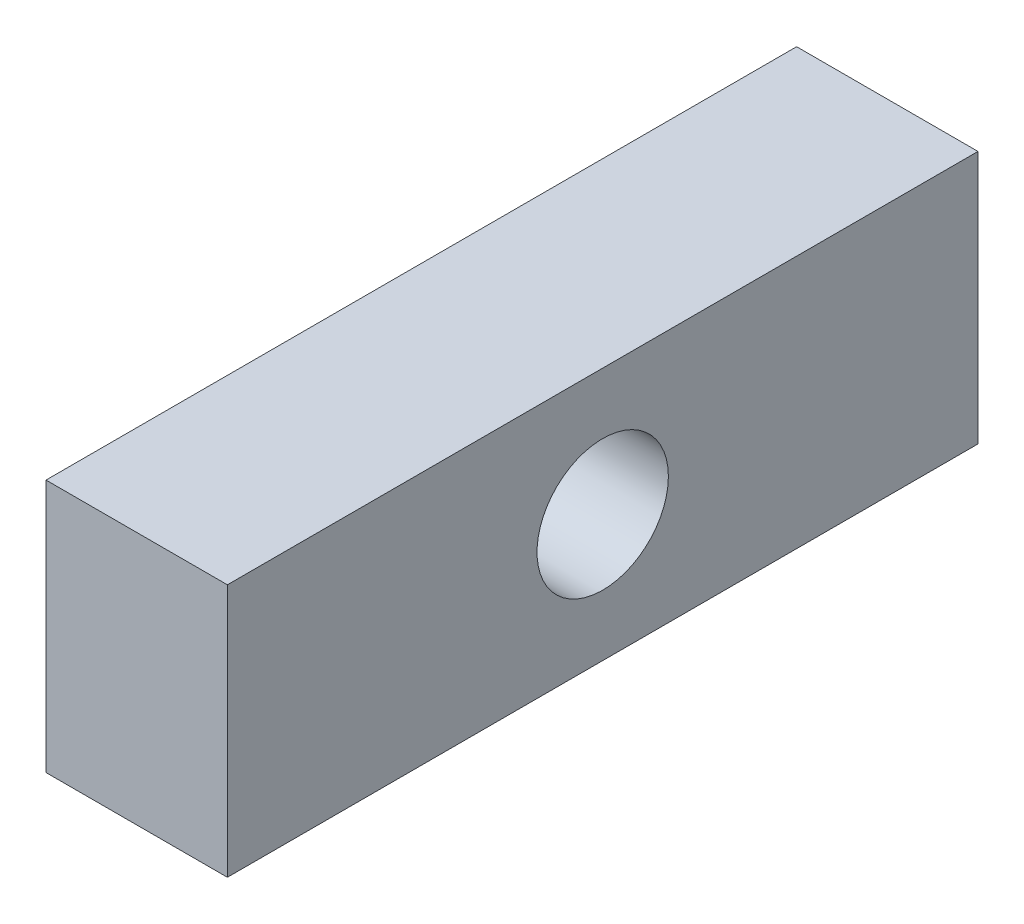
ISO-10303-21;
HEADER;
FILE_DESCRIPTION(('STEP AP214'),'2;1');
FILE_NAME('part.step','',(''),(''),'','','');
FILE_SCHEMA(('AUTOMOTIVE_DESIGN { 1 0 10303 214 1 1 1 1 }'));
ENDSEC;
DATA;
#1=APPLICATION_CONTEXT('core data for automotive mechanical design processes');
#2=APPLICATION_PROTOCOL_DEFINITION('international standard','automotive_design',2000,#1);
#3=PRODUCT_CONTEXT('',#1,'mechanical');
#4=PRODUCT('Part','Part','',(#3));
#5=PRODUCT_RELATED_PRODUCT_CATEGORY('part','',(#4));
#6=PRODUCT_DEFINITION_FORMATION('','',#4);
#7=PRODUCT_DEFINITION_CONTEXT('part definition',#1,'design');
#8=PRODUCT_DEFINITION('design','',#6,#7);
#9=PRODUCT_DEFINITION_SHAPE('','',#8);
#10=(LENGTH_UNIT() NAMED_UNIT(*) SI_UNIT(.MILLI.,.METRE.));
#11=(NAMED_UNIT(*) PLANE_ANGLE_UNIT() SI_UNIT($,.RADIAN.));
#12=(NAMED_UNIT(*) SI_UNIT($,.STERADIAN.) SOLID_ANGLE_UNIT());
#13=UNCERTAINTY_MEASURE_WITH_UNIT(LENGTH_MEASURE(1.E-05),#10,'distance_accuracy_value','');
#14=(GEOMETRIC_REPRESENTATION_CONTEXT(3) GLOBAL_UNCERTAINTY_ASSIGNED_CONTEXT((#13)) GLOBAL_UNIT_ASSIGNED_CONTEXT((#10,
#11,#12)) REPRESENTATION_CONTEXT('',''));
#15=CARTESIAN_POINT('',(0.,0.,0.));
#16=DIRECTION('',(0.,0.,1.));
#17=DIRECTION('',(1.,0.,0.));
#18=AXIS2_PLACEMENT_3D('',#15,#16,#17);
#19=CARTESIAN_POINT('',(0.,0.,12.));
#20=DIRECTION('',(0.,0.,1.));
#21=DIRECTION('',(1.,0.,0.));
#22=AXIS2_PLACEMENT_3D('',#19,#20,#21);
#23=PLANE('',#22);
#24=DIRECTION('',(-1.,0.,0.));
#25=VECTOR('',#24,1.);
#26=CARTESIAN_POINT('',(0.,-4.05,12.));
#27=LINE('',#26,#25);
#28=CARTESIAN_POINT('',(2.9,-4.05,12.));
#29=VERTEX_POINT('',#28);
#30=CARTESIAN_POINT('',(-2.9,-4.05,12.));
#31=VERTEX_POINT('',#30);
#32=EDGE_CURVE('E11',#29,#31,#27,.T.);
#33=ORIENTED_EDGE('',*,*,#32,.F.);
#34=DIRECTION('',(0.,-1.,0.));
#35=VECTOR('',#34,1.);
#36=CARTESIAN_POINT('',(2.9,0.,12.));
#37=LINE('',#36,#35);
#38=CARTESIAN_POINT('',(2.9,4.05,12.));
#39=VERTEX_POINT('',#38);
#40=EDGE_CURVE('E63',#39,#29,#37,.T.);
#41=ORIENTED_EDGE('',*,*,#40,.F.);
#42=DIRECTION('',(1.,0.,0.));
#43=VECTOR('',#42,1.);
#44=CARTESIAN_POINT('',(0.,4.05,12.));
#45=LINE('',#44,#43);
#46=CARTESIAN_POINT('',(-2.9,4.05,12.));
#47=VERTEX_POINT('',#46);
#48=EDGE_CURVE('E102',#47,#39,#45,.T.);
#49=ORIENTED_EDGE('',*,*,#48,.F.);
#50=DIRECTION('',(0.,1.,0.));
#51=VECTOR('',#50,1.);
#52=CARTESIAN_POINT('',(-2.9,0.,12.));
#53=LINE('',#52,#51);
#54=EDGE_CURVE('E26',#31,#47,#53,.T.);
#55=ORIENTED_EDGE('',*,*,#54,.F.);
#56=EDGE_LOOP('',(#33,#41,#49,#55));
#57=FACE_BOUND('',#56,.T.);
#58=ADVANCED_FACE('F17',(#57),#23,.T.);
#59=CARTESIAN_POINT('',(0.,-4.05,-12.));
#60=DIRECTION('',(0.,-1.,0.));
#61=DIRECTION('',(0.,0.,-1.));
#62=AXIS2_PLACEMENT_3D('',#59,#60,#61);
#63=PLANE('',#62);
#64=DIRECTION('',(0.,0.,1.));
#65=VECTOR('',#64,1.);
#66=CARTESIAN_POINT('',(2.9,-4.05,-12.));
#67=LINE('',#66,#65);
#68=CARTESIAN_POINT('',(2.9,-4.05,-12.));
#69=VERTEX_POINT('',#68);
#70=EDGE_CURVE('E56',#69,#29,#67,.T.);
#71=ORIENTED_EDGE('',*,*,#70,.T.);
#72=ORIENTED_EDGE('',*,*,#32,.T.);
#73=DIRECTION('',(0.,0.,1.));
#74=VECTOR('',#73,1.);
#75=CARTESIAN_POINT('',(-2.9,-4.05,-12.));
#76=LINE('',#75,#74);
#77=CARTESIAN_POINT('',(-2.9,-4.05,-12.));
#78=VERTEX_POINT('',#77);
#79=EDGE_CURVE('E70',#78,#31,#76,.T.);
#80=ORIENTED_EDGE('',*,*,#79,.F.);
#81=DIRECTION('',(1.,0.,0.));
#82=VECTOR('',#81,1.);
#83=CARTESIAN_POINT('',(0.,-4.05,-12.));
#84=LINE('',#83,#82);
#85=EDGE_CURVE('E68',#78,#69,#84,.T.);
#86=ORIENTED_EDGE('',*,*,#85,.T.);
#87=EDGE_LOOP('',(#71,#72,#80,#86));
#88=FACE_BOUND('',#87,.T.);
#89=ADVANCED_FACE('F69',(#88),#63,.T.);
#90=CARTESIAN_POINT('',(-2.9,0.,-12.));
#91=DIRECTION('',(-1.,0.,0.));
#92=DIRECTION('',(0.,0.,1.));
#93=AXIS2_PLACEMENT_3D('',#90,#91,#92);
#94=PLANE('',#93);
#95=CARTESIAN_POINT('',(-2.9,0.,0.));
#96=DIRECTION('',(-1.,0.,0.));
#97=DIRECTION('',(0.,0.,1.));
#98=AXIS2_PLACEMENT_3D('',#95,#96,#97);
#99=CIRCLE('',#98,2.1);
#100=CARTESIAN_POINT('',(-2.9,0.,2.1));
#101=VERTEX_POINT('',#100);
#102=EDGE_CURVE('E76',#101,#101,#99,.T.);
#103=ORIENTED_EDGE('',*,*,#102,.F.);
#104=EDGE_LOOP('',(#103));
#105=FACE_BOUND('',#104,.T.);
#106=ORIENTED_EDGE('',*,*,#79,.T.);
#107=ORIENTED_EDGE('',*,*,#54,.T.);
#108=DIRECTION('',(0.,0.,1.));
#109=VECTOR('',#108,1.);
#110=CARTESIAN_POINT('',(-2.9,4.05,-12.));
#111=LINE('',#110,#109);
#112=CARTESIAN_POINT('',(-2.9,4.05,-12.));
#113=VERTEX_POINT('',#112);
#114=EDGE_CURVE('E94',#113,#47,#111,.T.);
#115=ORIENTED_EDGE('',*,*,#114,.F.);
#116=DIRECTION('',(0.,-1.,0.));
#117=VECTOR('',#116,1.);
#118=CARTESIAN_POINT('',(-2.9,0.,-12.));
#119=LINE('',#118,#117);
#120=EDGE_CURVE('E75',#113,#78,#119,.T.);
#121=ORIENTED_EDGE('',*,*,#120,.T.);
#122=EDGE_LOOP('',(#106,#107,#115,#121));
#123=FACE_BOUND('',#122,.T.);
#124=ADVANCED_FACE('F116',(#105,#123),#94,.T.);
#125=CARTESIAN_POINT('',(0.,4.05,-12.));
#126=DIRECTION('',(0.,1.,0.));
#127=DIRECTION('',(0.,0.,1.));
#128=AXIS2_PLACEMENT_3D('',#125,#126,#127);
#129=PLANE('',#128);
#130=ORIENTED_EDGE('',*,*,#114,.T.);
#131=ORIENTED_EDGE('',*,*,#48,.T.);
#132=DIRECTION('',(0.,0.,1.));
#133=VECTOR('',#132,1.);
#134=CARTESIAN_POINT('',(2.9,4.05,-12.));
#135=LINE('',#134,#133);
#136=CARTESIAN_POINT('',(2.9,4.05,-12.));
#137=VERTEX_POINT('',#136);
#138=EDGE_CURVE('E65',#137,#39,#135,.T.);
#139=ORIENTED_EDGE('',*,*,#138,.F.);
#140=DIRECTION('',(-1.,0.,0.));
#141=VECTOR('',#140,1.);
#142=CARTESIAN_POINT('',(0.,4.05,-12.));
#143=LINE('',#142,#141);
#144=EDGE_CURVE('E81',#137,#113,#143,.T.);
#145=ORIENTED_EDGE('',*,*,#144,.T.);
#146=EDGE_LOOP('',(#130,#131,#139,#145));
#147=FACE_BOUND('',#146,.T.);
#148=ADVANCED_FACE('F118',(#147),#129,.T.);
#149=CARTESIAN_POINT('',(0.,0.,-12.));
#150=DIRECTION('',(0.,0.,-1.));
#151=DIRECTION('',(-1.,0.,0.));
#152=AXIS2_PLACEMENT_3D('',#149,#150,#151);
#153=PLANE('',#152);
#154=DIRECTION('',(0.,1.,0.));
#155=VECTOR('',#154,1.);
#156=CARTESIAN_POINT('',(2.9,0.,-12.));
#157=LINE('',#156,#155);
#158=EDGE_CURVE('E61',#69,#137,#157,.T.);
#159=ORIENTED_EDGE('',*,*,#158,.F.);
#160=ORIENTED_EDGE('',*,*,#85,.F.);
#161=ORIENTED_EDGE('',*,*,#120,.F.);
#162=ORIENTED_EDGE('',*,*,#144,.F.);
#163=EDGE_LOOP('',(#159,#160,#161,#162));
#164=FACE_BOUND('',#163,.T.);
#165=ADVANCED_FACE('F79',(#164),#153,.T.);
#166=CARTESIAN_POINT('',(2.9,0.,-12.));
#167=DIRECTION('',(1.,0.,0.));
#168=DIRECTION('',(0.,0.,-1.));
#169=AXIS2_PLACEMENT_3D('',#166,#167,#168);
#170=PLANE('',#169);
#171=CARTESIAN_POINT('',(2.9,0.,0.));
#172=DIRECTION('',(1.,0.,0.));
#173=DIRECTION('',(0.,0.,-1.));
#174=AXIS2_PLACEMENT_3D('',#171,#172,#173);
#175=CIRCLE('',#174,2.1);
#176=CARTESIAN_POINT('',(2.9,0.,-2.1));
#177=VERTEX_POINT('',#176);
#178=EDGE_CURVE('E20',#177,#177,#175,.T.);
#179=ORIENTED_EDGE('',*,*,#178,.F.);
#180=EDGE_LOOP('',(#179));
#181=FACE_BOUND('',#180,.T.);
#182=ORIENTED_EDGE('',*,*,#158,.T.);
#183=ORIENTED_EDGE('',*,*,#138,.T.);
#184=ORIENTED_EDGE('',*,*,#40,.T.);
#185=ORIENTED_EDGE('',*,*,#70,.F.);
#186=EDGE_LOOP('',(#182,#183,#184,#185));
#187=FACE_BOUND('',#186,.T.);
#188=ADVANCED_FACE('F58',(#181,#187),#170,.T.);
#189=CARTESIAN_POINT('',(-3.2,0.,0.));
#190=DIRECTION('',(1.,0.,0.));
#191=DIRECTION('',(0.,0.,-1.));
#192=AXIS2_PLACEMENT_3D('',#189,#190,#191);
#193=CYLINDRICAL_SURFACE('',#192,2.1);
#194=ORIENTED_EDGE('',*,*,#102,.T.);
#195=EDGE_LOOP('',(#194));
#196=FACE_BOUND('',#195,.T.);
#197=ORIENTED_EDGE('',*,*,#178,.T.);
#198=EDGE_LOOP('',(#197));
#199=FACE_BOUND('',#198,.T.);
#200=ADVANCED_FACE('F113',(#196,#199),#193,.F.);
#201=CLOSED_SHELL('',(#58,#89,#124,#148,#165,#188,#200));
#202=MANIFOLD_SOLID_BREP('B1',#201);
#203=ADVANCED_BREP_SHAPE_REPRESENTATION('',(#18,#202),#14);
#204=SHAPE_DEFINITION_REPRESENTATION(#9,#203);
ENDSEC;
END-ISO-10303-21;
